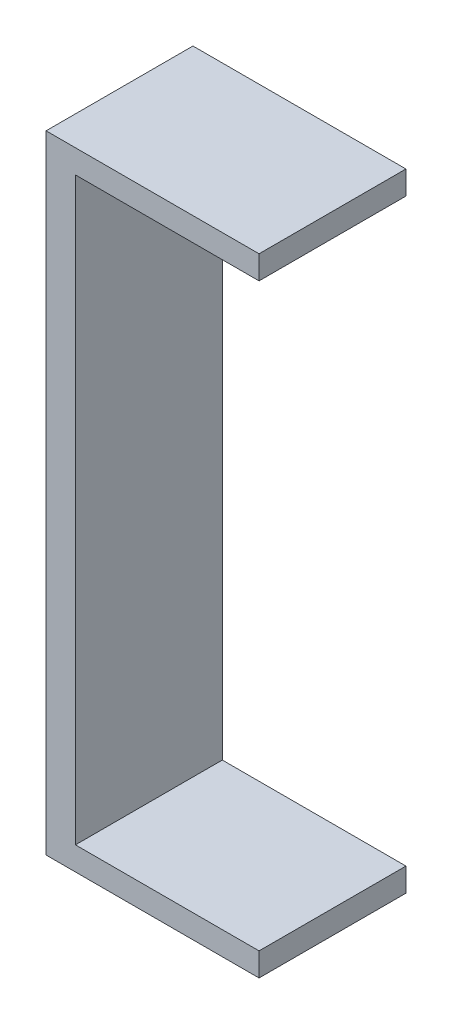
ISO-10303-21;
HEADER;
FILE_DESCRIPTION(('STEP AP214'),'2;1');
FILE_NAME('part.step','',(''),(''),'','','');
FILE_SCHEMA(('AUTOMOTIVE_DESIGN { 1 0 10303 214 1 1 1 1 }'));
ENDSEC;
DATA;
#1=APPLICATION_CONTEXT('core data for automotive mechanical design processes');
#2=APPLICATION_PROTOCOL_DEFINITION('international standard','automotive_design',2000,#1);
#3=PRODUCT_CONTEXT('',#1,'mechanical');
#4=PRODUCT('Part','Part','',(#3));
#5=PRODUCT_RELATED_PRODUCT_CATEGORY('part','',(#4));
#6=PRODUCT_DEFINITION_FORMATION('','',#4);
#7=PRODUCT_DEFINITION_CONTEXT('part definition',#1,'design');
#8=PRODUCT_DEFINITION('design','',#6,#7);
#9=PRODUCT_DEFINITION_SHAPE('','',#8);
#10=(LENGTH_UNIT() NAMED_UNIT(*) SI_UNIT(.MILLI.,.METRE.));
#11=(NAMED_UNIT(*) PLANE_ANGLE_UNIT() SI_UNIT($,.RADIAN.));
#12=(NAMED_UNIT(*) SI_UNIT($,.STERADIAN.) SOLID_ANGLE_UNIT());
#13=UNCERTAINTY_MEASURE_WITH_UNIT(LENGTH_MEASURE(1.E-05),#10,'distance_accuracy_value','');
#14=(GEOMETRIC_REPRESENTATION_CONTEXT(3) GLOBAL_UNCERTAINTY_ASSIGNED_CONTEXT((#13)) GLOBAL_UNIT_ASSIGNED_CONTEXT((#10,
#11,#12)) REPRESENTATION_CONTEXT('',''));
#15=CARTESIAN_POINT('',(0.,0.,0.));
#16=DIRECTION('',(0.,0.,1.));
#17=DIRECTION('',(1.,0.,0.));
#18=AXIS2_PLACEMENT_3D('',#15,#16,#17);
#19=CARTESIAN_POINT('',(18.415,52.197,12.7));
#20=DIRECTION('',(-1.,0.,0.));
#21=DIRECTION('',(0.,-1.,0.));
#22=AXIS2_PLACEMENT_3D('',#19,#20,#21);
#23=PLANE('',#22);
#24=DIRECTION('',(0.,1.,0.));
#25=VECTOR('',#24,1.);
#26=CARTESIAN_POINT('',(18.415,52.197,0.));
#27=LINE('',#26,#25);
#28=CARTESIAN_POINT('',(18.415,52.197,0.));
#29=VERTEX_POINT('',#28);
#30=CARTESIAN_POINT('',(18.415,54.229,0.));
#31=VERTEX_POINT('',#30);
#32=EDGE_CURVE('E128',#29,#31,#27,.T.);
#33=ORIENTED_EDGE('',*,*,#32,.T.);
#34=DIRECTION('',(0.,0.,-1.));
#35=VECTOR('',#34,1.);
#36=CARTESIAN_POINT('',(18.415,54.229,12.7));
#37=LINE('',#36,#35);
#38=CARTESIAN_POINT('',(18.415,54.229,12.7));
#39=VERTEX_POINT('',#38);
#40=EDGE_CURVE('E11',#39,#31,#37,.T.);
#41=ORIENTED_EDGE('',*,*,#40,.F.);
#42=DIRECTION('',(0.,1.,0.));
#43=VECTOR('',#42,1.);
#44=CARTESIAN_POINT('',(18.415,52.197,12.7));
#45=LINE('',#44,#43);
#46=CARTESIAN_POINT('',(18.415,52.197,12.7));
#47=VERTEX_POINT('',#46);
#48=EDGE_CURVE('E142',#47,#39,#45,.T.);
#49=ORIENTED_EDGE('',*,*,#48,.F.);
#50=DIRECTION('',(0.,0.,-1.));
#51=VECTOR('',#50,1.);
#52=CARTESIAN_POINT('',(18.415,52.197,12.7));
#53=LINE('',#52,#51);
#54=EDGE_CURVE('E124',#47,#29,#53,.T.);
#55=ORIENTED_EDGE('',*,*,#54,.T.);
#56=EDGE_LOOP('',(#33,#41,#49,#55));
#57=FACE_BOUND('',#56,.T.);
#58=ADVANCED_FACE('F32',(#57),#23,.F.);
#59=CARTESIAN_POINT('',(18.415,54.229,12.7));
#60=DIRECTION('',(0.,-1.,0.));
#61=DIRECTION('',(0.,0.,-1.));
#62=AXIS2_PLACEMENT_3D('',#59,#60,#61);
#63=PLANE('',#62);
#64=DIRECTION('',(-1.,0.,0.));
#65=VECTOR('',#64,1.);
#66=CARTESIAN_POINT('',(18.415,54.229,0.));
#67=LINE('',#66,#65);
#68=CARTESIAN_POINT('',(0.,54.229,0.));
#69=VERTEX_POINT('',#68);
#70=EDGE_CURVE('E131',#31,#69,#67,.T.);
#71=ORIENTED_EDGE('',*,*,#70,.T.);
#72=DIRECTION('',(0.,0.,-1.));
#73=VECTOR('',#72,1.);
#74=CARTESIAN_POINT('',(0.,54.229,12.7));
#75=LINE('',#74,#73);
#76=CARTESIAN_POINT('',(0.,54.229,12.7));
#77=VERTEX_POINT('',#76);
#78=EDGE_CURVE('E40',#77,#69,#75,.T.);
#79=ORIENTED_EDGE('',*,*,#78,.F.);
#80=DIRECTION('',(-1.,0.,0.));
#81=VECTOR('',#80,1.);
#82=CARTESIAN_POINT('',(18.415,54.229,12.7));
#83=LINE('',#82,#81);
#84=EDGE_CURVE('E91',#39,#77,#83,.T.);
#85=ORIENTED_EDGE('',*,*,#84,.F.);
#86=ORIENTED_EDGE('',*,*,#40,.T.);
#87=EDGE_LOOP('',(#71,#79,#85,#86));
#88=FACE_BOUND('',#87,.T.);
#89=ADVANCED_FACE('F177',(#88),#63,.F.);
#90=CARTESIAN_POINT('',(0.,54.229,12.7));
#91=DIRECTION('',(1.,0.,0.));
#92=DIRECTION('',(0.,0.,-1.));
#93=AXIS2_PLACEMENT_3D('',#90,#91,#92);
#94=PLANE('',#93);
#95=DIRECTION('',(0.,-1.,0.));
#96=VECTOR('',#95,1.);
#97=CARTESIAN_POINT('',(0.,54.229,0.));
#98=LINE('',#97,#96);
#99=CARTESIAN_POINT('',(0.,0.,0.));
#100=VERTEX_POINT('',#99);
#101=EDGE_CURVE('E133',#69,#100,#98,.T.);
#102=ORIENTED_EDGE('',*,*,#101,.T.);
#103=DIRECTION('',(0.,0.,-1.));
#104=VECTOR('',#103,1.);
#105=CARTESIAN_POINT('',(0.,0.,12.7));
#106=LINE('',#105,#104);
#107=CARTESIAN_POINT('',(0.,0.,12.7));
#108=VERTEX_POINT('',#107);
#109=EDGE_CURVE('E149',#108,#100,#106,.T.);
#110=ORIENTED_EDGE('',*,*,#109,.F.);
#111=DIRECTION('',(0.,-1.,0.));
#112=VECTOR('',#111,1.);
#113=CARTESIAN_POINT('',(0.,54.229,12.7));
#114=LINE('',#113,#112);
#115=EDGE_CURVE('E157',#77,#108,#114,.T.);
#116=ORIENTED_EDGE('',*,*,#115,.F.);
#117=ORIENTED_EDGE('',*,*,#78,.T.);
#118=EDGE_LOOP('',(#102,#110,#116,#117));
#119=FACE_BOUND('',#118,.T.);
#120=ADVANCED_FACE('F155',(#119),#94,.F.);
#121=CARTESIAN_POINT('',(0.,0.,12.7));
#122=DIRECTION('',(0.,1.,0.));
#123=DIRECTION('',(0.,0.,1.));
#124=AXIS2_PLACEMENT_3D('',#121,#122,#123);
#125=PLANE('',#124);
#126=DIRECTION('',(1.,0.,0.));
#127=VECTOR('',#126,1.);
#128=CARTESIAN_POINT('',(0.,0.,0.));
#129=LINE('',#128,#127);
#130=CARTESIAN_POINT('',(18.415,0.,0.));
#131=VERTEX_POINT('',#130);
#132=EDGE_CURVE('E135',#100,#131,#129,.T.);
#133=ORIENTED_EDGE('',*,*,#132,.T.);
#134=DIRECTION('',(0.,0.,-1.));
#135=VECTOR('',#134,1.);
#136=CARTESIAN_POINT('',(18.415,0.,12.7));
#137=LINE('',#136,#135);
#138=CARTESIAN_POINT('',(18.415,0.,12.7));
#139=VERTEX_POINT('',#138);
#140=EDGE_CURVE('E146',#139,#131,#137,.T.);
#141=ORIENTED_EDGE('',*,*,#140,.F.);
#142=DIRECTION('',(1.,0.,0.));
#143=VECTOR('',#142,1.);
#144=CARTESIAN_POINT('',(0.,0.,12.7));
#145=LINE('',#144,#143);
#146=EDGE_CURVE('E169',#108,#139,#145,.T.);
#147=ORIENTED_EDGE('',*,*,#146,.F.);
#148=ORIENTED_EDGE('',*,*,#109,.T.);
#149=EDGE_LOOP('',(#133,#141,#147,#148));
#150=FACE_BOUND('',#149,.T.);
#151=ADVANCED_FACE('F165',(#150),#125,.F.);
#152=CARTESIAN_POINT('',(18.415,0.,12.7));
#153=DIRECTION('',(-1.,0.,0.));
#154=DIRECTION('',(0.,-1.,0.));
#155=AXIS2_PLACEMENT_3D('',#152,#153,#154);
#156=PLANE('',#155);
#157=DIRECTION('',(0.,1.,0.));
#158=VECTOR('',#157,1.);
#159=CARTESIAN_POINT('',(18.415,0.,0.));
#160=LINE('',#159,#158);
#161=CARTESIAN_POINT('',(18.415,2.032,0.));
#162=VERTEX_POINT('',#161);
#163=EDGE_CURVE('E137',#131,#162,#160,.T.);
#164=ORIENTED_EDGE('',*,*,#163,.T.);
#165=DIRECTION('',(0.,0.,-1.));
#166=VECTOR('',#165,1.);
#167=CARTESIAN_POINT('',(18.415,2.032,12.7));
#168=LINE('',#167,#166);
#169=CARTESIAN_POINT('',(18.415,2.032,12.7));
#170=VERTEX_POINT('',#169);
#171=EDGE_CURVE('E119',#170,#162,#168,.T.);
#172=ORIENTED_EDGE('',*,*,#171,.F.);
#173=DIRECTION('',(0.,1.,0.));
#174=VECTOR('',#173,1.);
#175=CARTESIAN_POINT('',(18.415,0.,12.7));
#176=LINE('',#175,#174);
#177=EDGE_CURVE('E110',#139,#170,#176,.T.);
#178=ORIENTED_EDGE('',*,*,#177,.F.);
#179=ORIENTED_EDGE('',*,*,#140,.T.);
#180=EDGE_LOOP('',(#164,#172,#178,#179));
#181=FACE_BOUND('',#180,.T.);
#182=ADVANCED_FACE('F168',(#181),#156,.F.);
#183=CARTESIAN_POINT('',(18.415,2.032,12.7));
#184=DIRECTION('',(0.,-1.,0.));
#185=DIRECTION('',(1.,0.,0.));
#186=AXIS2_PLACEMENT_3D('',#183,#184,#185);
#187=PLANE('',#186);
#188=DIRECTION('',(-1.,0.,0.));
#189=VECTOR('',#188,1.);
#190=CARTESIAN_POINT('',(18.415,2.032,0.));
#191=LINE('',#190,#189);
#192=CARTESIAN_POINT('',(2.54000000000001,2.032,0.));
#193=VERTEX_POINT('',#192);
#194=EDGE_CURVE('E118',#162,#193,#191,.T.);
#195=ORIENTED_EDGE('',*,*,#194,.T.);
#196=DIRECTION('',(0.,0.,-1.));
#197=VECTOR('',#196,1.);
#198=CARTESIAN_POINT('',(2.54000000000001,2.032,12.7));
#199=LINE('',#198,#197);
#200=CARTESIAN_POINT('',(2.54000000000001,2.032,12.7));
#201=VERTEX_POINT('',#200);
#202=EDGE_CURVE('E115',#201,#193,#199,.T.);
#203=ORIENTED_EDGE('',*,*,#202,.F.);
#204=DIRECTION('',(-1.,0.,0.));
#205=VECTOR('',#204,1.);
#206=CARTESIAN_POINT('',(18.415,2.032,12.7));
#207=LINE('',#206,#205);
#208=EDGE_CURVE('E104',#170,#201,#207,.T.);
#209=ORIENTED_EDGE('',*,*,#208,.F.);
#210=ORIENTED_EDGE('',*,*,#171,.T.);
#211=EDGE_LOOP('',(#195,#203,#209,#210));
#212=FACE_BOUND('',#211,.T.);
#213=ADVANCED_FACE('F116',(#212),#187,.F.);
#214=CARTESIAN_POINT('',(2.54000000000001,2.032,12.7));
#215=DIRECTION('',(-1.,0.,0.));
#216=DIRECTION('',(0.,-1.,0.));
#217=AXIS2_PLACEMENT_3D('',#214,#215,#216);
#218=PLANE('',#217);
#219=DIRECTION('',(0.,1.,0.));
#220=VECTOR('',#219,1.);
#221=CARTESIAN_POINT('',(2.54000000000001,2.032,0.));
#222=LINE('',#221,#220);
#223=CARTESIAN_POINT('',(2.54000000000001,52.197,0.));
#224=VERTEX_POINT('',#223);
#225=EDGE_CURVE('E77',#193,#224,#222,.T.);
#226=ORIENTED_EDGE('',*,*,#225,.T.);
#227=DIRECTION('',(0.,0.,-1.));
#228=VECTOR('',#227,1.);
#229=CARTESIAN_POINT('',(2.54000000000001,52.197,12.7));
#230=LINE('',#229,#228);
#231=CARTESIAN_POINT('',(2.54000000000001,52.197,12.7));
#232=VERTEX_POINT('',#231);
#233=EDGE_CURVE('E120',#232,#224,#230,.T.);
#234=ORIENTED_EDGE('',*,*,#233,.F.);
#235=DIRECTION('',(0.,1.,0.));
#236=VECTOR('',#235,1.);
#237=CARTESIAN_POINT('',(2.54000000000001,2.032,12.7));
#238=LINE('',#237,#236);
#239=EDGE_CURVE('E108',#201,#232,#238,.T.);
#240=ORIENTED_EDGE('',*,*,#239,.F.);
#241=ORIENTED_EDGE('',*,*,#202,.T.);
#242=EDGE_LOOP('',(#226,#234,#240,#241));
#243=FACE_BOUND('',#242,.T.);
#244=ADVANCED_FACE('F122',(#243),#218,.F.);
#245=CARTESIAN_POINT('',(2.54000000000001,52.197,12.7));
#246=DIRECTION('',(0.,1.,0.));
#247=DIRECTION('',(0.,0.,1.));
#248=AXIS2_PLACEMENT_3D('',#245,#246,#247);
#249=PLANE('',#248);
#250=DIRECTION('',(1.,0.,0.));
#251=VECTOR('',#250,1.);
#252=CARTESIAN_POINT('',(2.54000000000001,52.197,0.));
#253=LINE('',#252,#251);
#254=EDGE_CURVE('E83',#224,#29,#253,.T.);
#255=ORIENTED_EDGE('',*,*,#254,.T.);
#256=ORIENTED_EDGE('',*,*,#54,.F.);
#257=DIRECTION('',(1.,0.,0.));
#258=VECTOR('',#257,1.);
#259=CARTESIAN_POINT('',(2.54000000000001,52.197,12.7));
#260=LINE('',#259,#258);
#261=EDGE_CURVE('E48',#232,#47,#260,.T.);
#262=ORIENTED_EDGE('',*,*,#261,.F.);
#263=ORIENTED_EDGE('',*,*,#233,.T.);
#264=EDGE_LOOP('',(#255,#256,#262,#263));
#265=FACE_BOUND('',#264,.T.);
#266=ADVANCED_FACE('F193',(#265),#249,.F.);
#267=CARTESIAN_POINT('',(0.,0.,12.7));
#268=DIRECTION('',(0.,0.,1.));
#269=DIRECTION('',(1.,0.,0.));
#270=AXIS2_PLACEMENT_3D('',#267,#268,#269);
#271=PLANE('',#270);
#272=ORIENTED_EDGE('',*,*,#48,.T.);
#273=ORIENTED_EDGE('',*,*,#84,.T.);
#274=ORIENTED_EDGE('',*,*,#115,.T.);
#275=ORIENTED_EDGE('',*,*,#146,.T.);
#276=ORIENTED_EDGE('',*,*,#177,.T.);
#277=ORIENTED_EDGE('',*,*,#208,.T.);
#278=ORIENTED_EDGE('',*,*,#239,.T.);
#279=ORIENTED_EDGE('',*,*,#261,.T.);
#280=EDGE_LOOP('',(#272,#273,#274,#275,#276,#277,#278,#279));
#281=FACE_BOUND('',#280,.T.);
#282=ADVANCED_FACE('F106',(#281),#271,.T.);
#283=CARTESIAN_POINT('',(0.,0.,0.));
#284=DIRECTION('',(0.,0.,1.));
#285=DIRECTION('',(1.,0.,0.));
#286=AXIS2_PLACEMENT_3D('',#283,#284,#285);
#287=PLANE('',#286);
#288=ORIENTED_EDGE('',*,*,#32,.F.);
#289=ORIENTED_EDGE('',*,*,#254,.F.);
#290=ORIENTED_EDGE('',*,*,#225,.F.);
#291=ORIENTED_EDGE('',*,*,#194,.F.);
#292=ORIENTED_EDGE('',*,*,#163,.F.);
#293=ORIENTED_EDGE('',*,*,#132,.F.);
#294=ORIENTED_EDGE('',*,*,#101,.F.);
#295=ORIENTED_EDGE('',*,*,#70,.F.);
#296=EDGE_LOOP('',(#288,#289,#290,#291,#292,#293,#294,#295));
#297=FACE_BOUND('',#296,.T.);
#298=ADVANCED_FACE('F161',(#297),#287,.F.);
#299=CLOSED_SHELL('',(#58,#89,#120,#151,#182,#213,#244,#266,#282,#298));
#300=MANIFOLD_SOLID_BREP('B2',#299);
#301=ADVANCED_BREP_SHAPE_REPRESENTATION('',(#18,#300),#14);
#302=SHAPE_DEFINITION_REPRESENTATION(#9,#301);
ENDSEC;
END-ISO-10303-21;
